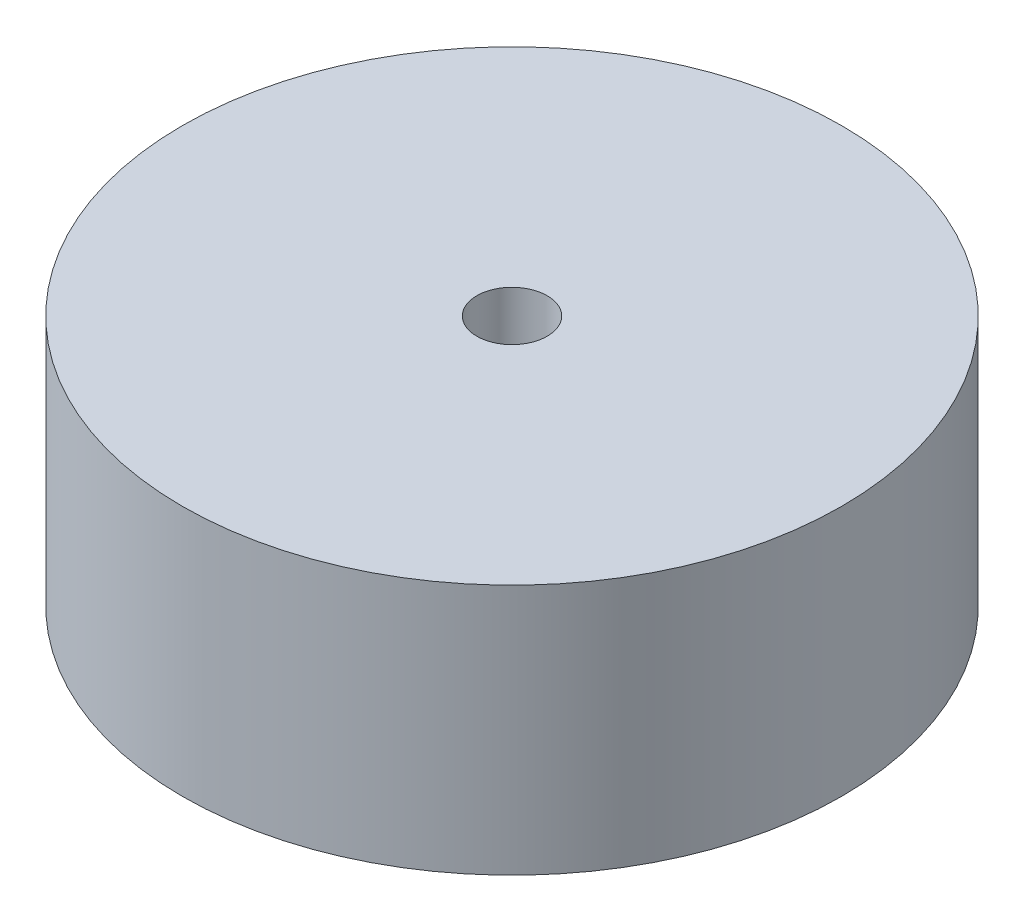
ISO-10303-21;
HEADER;
FILE_DESCRIPTION(('STEP AP214'),'2;1');
FILE_NAME('part.step','',(''),(''),'','','');
FILE_SCHEMA(('AUTOMOTIVE_DESIGN { 1 0 10303 214 1 1 1 1 }'));
ENDSEC;
DATA;
#1=APPLICATION_CONTEXT('core data for automotive mechanical design processes');
#2=APPLICATION_PROTOCOL_DEFINITION('international standard','automotive_design',2000,#1);
#3=PRODUCT_CONTEXT('',#1,'mechanical');
#4=PRODUCT('Part','Part','',(#3));
#5=PRODUCT_RELATED_PRODUCT_CATEGORY('part','',(#4));
#6=PRODUCT_DEFINITION_FORMATION('','',#4);
#7=PRODUCT_DEFINITION_CONTEXT('part definition',#1,'design');
#8=PRODUCT_DEFINITION('design','',#6,#7);
#9=PRODUCT_DEFINITION_SHAPE('','',#8);
#10=(LENGTH_UNIT() NAMED_UNIT(*) SI_UNIT(.MILLI.,.METRE.));
#11=(NAMED_UNIT(*) PLANE_ANGLE_UNIT() SI_UNIT($,.RADIAN.));
#12=(NAMED_UNIT(*) SI_UNIT($,.STERADIAN.) SOLID_ANGLE_UNIT());
#13=UNCERTAINTY_MEASURE_WITH_UNIT(LENGTH_MEASURE(1.E-05),#10,'distance_accuracy_value','');
#14=(GEOMETRIC_REPRESENTATION_CONTEXT(3) GLOBAL_UNCERTAINTY_ASSIGNED_CONTEXT((#13)) GLOBAL_UNIT_ASSIGNED_CONTEXT((#10,
#11,#12)) REPRESENTATION_CONTEXT('',''));
#15=CARTESIAN_POINT('',(0.,0.,0.));
#16=DIRECTION('',(0.,0.,1.));
#17=DIRECTION('',(1.,0.,0.));
#18=AXIS2_PLACEMENT_3D('',#15,#16,#17);
#19=CARTESIAN_POINT('',(0.,25.4,0.));
#20=DIRECTION('',(0.,-1.,0.));
#21=DIRECTION('',(0.,0.,-1.));
#22=AXIS2_PLACEMENT_3D('',#19,#20,#21);
#23=CYLINDRICAL_SURFACE('',#22,33.3375);
#24=CARTESIAN_POINT('',(0.,25.4,0.));
#25=DIRECTION('',(0.,1.,0.));
#26=DIRECTION('',(0.,0.,1.));
#27=AXIS2_PLACEMENT_3D('',#24,#25,#26);
#28=CIRCLE('',#27,33.3375);
#29=CARTESIAN_POINT('',(0.,25.4,33.3375));
#30=VERTEX_POINT('',#29);
#31=EDGE_CURVE('E10',#30,#30,#28,.T.);
#32=ORIENTED_EDGE('',*,*,#31,.F.);
#33=EDGE_LOOP('',(#32));
#34=FACE_BOUND('',#33,.T.);
#35=CARTESIAN_POINT('',(0.,0.,0.));
#36=DIRECTION('',(0.,1.,0.));
#37=DIRECTION('',(0.,0.,1.));
#38=AXIS2_PLACEMENT_3D('',#35,#36,#37);
#39=CIRCLE('',#38,33.3375);
#40=CARTESIAN_POINT('',(0.,0.,33.3375));
#41=VERTEX_POINT('',#40);
#42=EDGE_CURVE('E40',#41,#41,#39,.T.);
#43=ORIENTED_EDGE('',*,*,#42,.T.);
#44=EDGE_LOOP('',(#43));
#45=FACE_BOUND('',#44,.T.);
#46=ADVANCED_FACE('F37',(#34,#45),#23,.T.);
#47=CARTESIAN_POINT('',(0.,25.4,0.));
#48=DIRECTION('',(0.,1.,0.));
#49=DIRECTION('',(0.,0.,1.));
#50=AXIS2_PLACEMENT_3D('',#47,#48,#49);
#51=PLANE('',#50);
#52=CARTESIAN_POINT('',(0.,25.4,0.));
#53=DIRECTION('',(0.,1.,0.));
#54=DIRECTION('',(0.,0.,1.));
#55=AXIS2_PLACEMENT_3D('',#52,#53,#54);
#56=CIRCLE('',#55,3.556);
#57=CARTESIAN_POINT('',(0.,25.4,3.556));
#58=VERTEX_POINT('',#57);
#59=EDGE_CURVE('E51',#58,#58,#56,.T.);
#60=ORIENTED_EDGE('',*,*,#59,.F.);
#61=EDGE_LOOP('',(#60));
#62=FACE_BOUND('',#61,.T.);
#63=ORIENTED_EDGE('',*,*,#31,.T.);
#64=EDGE_LOOP('',(#63));
#65=FACE_BOUND('',#64,.T.);
#66=ADVANCED_FACE('F68',(#62,#65),#51,.T.);
#67=CARTESIAN_POINT('',(0.,0.,0.));
#68=DIRECTION('',(0.,1.,0.));
#69=DIRECTION('',(0.,0.,1.));
#70=AXIS2_PLACEMENT_3D('',#67,#68,#69);
#71=PLANE('',#70);
#72=ORIENTED_EDGE('',*,*,#42,.F.);
#73=EDGE_LOOP('',(#72));
#74=FACE_BOUND('',#73,.T.);
#75=ADVANCED_FACE('F64',(#74),#71,.F.);
#76=CARTESIAN_POINT('',(0.,19.05,0.));
#77=DIRECTION('',(0.,1.,0.));
#78=DIRECTION('',(0.,0.,1.));
#79=AXIS2_PLACEMENT_3D('',#76,#77,#78);
#80=CYLINDRICAL_SURFACE('',#79,3.556);
#81=CARTESIAN_POINT('',(0.,19.05,0.));
#82=DIRECTION('',(0.,1.,0.));
#83=DIRECTION('',(0.,0.,1.));
#84=AXIS2_PLACEMENT_3D('',#81,#82,#83);
#85=CIRCLE('',#84,3.556);
#86=CARTESIAN_POINT('',(0.,19.05,3.556));
#87=VERTEX_POINT('',#86);
#88=EDGE_CURVE('E49',#87,#87,#85,.T.);
#89=ORIENTED_EDGE('',*,*,#88,.F.);
#90=EDGE_LOOP('',(#89));
#91=FACE_BOUND('',#90,.T.);
#92=ORIENTED_EDGE('',*,*,#59,.T.);
#93=EDGE_LOOP('',(#92));
#94=FACE_BOUND('',#93,.T.);
#95=ADVANCED_FACE('F61',(#91,#94),#80,.F.);
#96=CARTESIAN_POINT('',(0.,19.05,0.));
#97=DIRECTION('',(0.,1.,0.));
#98=DIRECTION('',(0.,0.,1.));
#99=AXIS2_PLACEMENT_3D('',#96,#97,#98);
#100=PLANE('',#99);
#101=ORIENTED_EDGE('',*,*,#88,.T.);
#102=EDGE_LOOP('',(#101));
#103=FACE_BOUND('',#102,.T.);
#104=ADVANCED_FACE('F59',(#103),#100,.T.);
#105=CLOSED_SHELL('',(#46,#66,#75,#95,#104));
#106=MANIFOLD_SOLID_BREP('B2',#105);
#107=ADVANCED_BREP_SHAPE_REPRESENTATION('',(#18,#106),#14);
#108=SHAPE_DEFINITION_REPRESENTATION(#9,#107);
ENDSEC;
END-ISO-10303-21;
